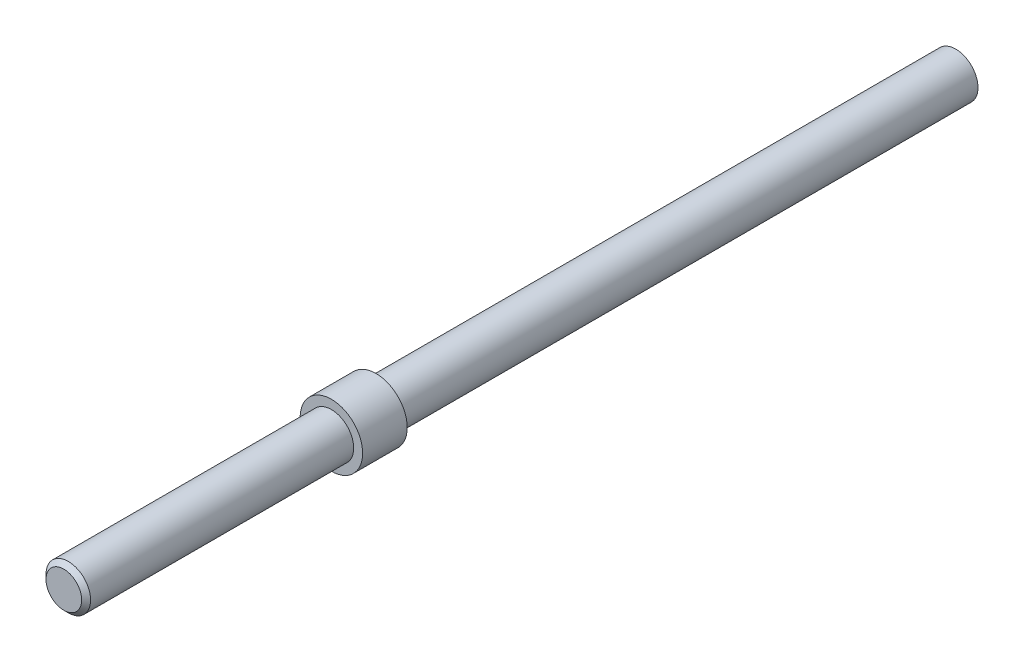
ISO-10303-21;
HEADER;
FILE_DESCRIPTION(('STEP AP214'),'2;1');
FILE_NAME('part.step','',(''),(''),'','','');
FILE_SCHEMA(('AUTOMOTIVE_DESIGN { 1 0 10303 214 1 1 1 1 }'));
ENDSEC;
DATA;
#1=APPLICATION_CONTEXT('core data for automotive mechanical design processes');
#2=APPLICATION_PROTOCOL_DEFINITION('international standard','automotive_design',2000,#1);
#3=PRODUCT_CONTEXT('',#1,'mechanical');
#4=PRODUCT('Part','Part','',(#3));
#5=PRODUCT_RELATED_PRODUCT_CATEGORY('part','',(#4));
#6=PRODUCT_DEFINITION_FORMATION('','',#4);
#7=PRODUCT_DEFINITION_CONTEXT('part definition',#1,'design');
#8=PRODUCT_DEFINITION('design','',#6,#7);
#9=PRODUCT_DEFINITION_SHAPE('','',#8);
#10=(LENGTH_UNIT() NAMED_UNIT(*) SI_UNIT(.MILLI.,.METRE.));
#11=(NAMED_UNIT(*) PLANE_ANGLE_UNIT() SI_UNIT($,.RADIAN.));
#12=(NAMED_UNIT(*) SI_UNIT($,.STERADIAN.) SOLID_ANGLE_UNIT());
#13=UNCERTAINTY_MEASURE_WITH_UNIT(LENGTH_MEASURE(1.E-05),#10,'distance_accuracy_value','');
#14=(GEOMETRIC_REPRESENTATION_CONTEXT(3) GLOBAL_UNCERTAINTY_ASSIGNED_CONTEXT((#13)) GLOBAL_UNIT_ASSIGNED_CONTEXT((#10,
#11,#12)) REPRESENTATION_CONTEXT('',''));
#15=CARTESIAN_POINT('',(0.,0.,0.));
#16=DIRECTION('',(0.,0.,1.));
#17=DIRECTION('',(1.,0.,0.));
#18=AXIS2_PLACEMENT_3D('',#15,#16,#17);
#19=CARTESIAN_POINT('',(0.,0.,200.));
#20=DIRECTION('',(0.,0.,-1.));
#21=DIRECTION('',(-1.,0.,0.));
#22=AXIS2_PLACEMENT_3D('',#19,#20,#21);
#23=CYLINDRICAL_SURFACE('',#22,5.);
#24=CARTESIAN_POINT('',(0.,0.,140.));
#25=DIRECTION('',(0.,0.,1.));
#26=DIRECTION('',(1.,0.,0.));
#27=AXIS2_PLACEMENT_3D('',#24,#25,#26);
#28=CIRCLE('',#27,5.);
#29=CARTESIAN_POINT('',(5.,0.,140.));
#30=VERTEX_POINT('',#29);
#31=EDGE_CURVE('E41',#30,#30,#28,.T.);
#32=ORIENTED_EDGE('',*,*,#31,.T.);
#33=EDGE_LOOP('',(#32));
#34=FACE_BOUND('',#33,.T.);
#35=CARTESIAN_POINT('',(0.,0.,199.));
#36=DIRECTION('',(0.,0.,1.));
#37=DIRECTION('',(1.,0.,0.));
#38=AXIS2_PLACEMENT_3D('',#35,#36,#37);
#39=CIRCLE('',#38,5.);
#40=CARTESIAN_POINT('',(5.,0.,199.));
#41=VERTEX_POINT('',#40);
#42=EDGE_CURVE('E46',#41,#41,#39,.F.);
#43=ORIENTED_EDGE('',*,*,#42,.T.);
#44=EDGE_LOOP('',(#43));
#45=FACE_BOUND('',#44,.T.);
#46=ADVANCED_FACE('F37',(#34,#45),#23,.T.);
#47=CARTESIAN_POINT('',(0.,0.,200.));
#48=DIRECTION('',(0.,0.,1.));
#49=DIRECTION('',(1.,0.,0.));
#50=AXIS2_PLACEMENT_3D('',#47,#48,#49);
#51=PLANE('',#50);
#52=CARTESIAN_POINT('',(0.,0.,200.));
#53=DIRECTION('',(0.,0.,1.));
#54=DIRECTION('',(1.,0.,0.));
#55=AXIS2_PLACEMENT_3D('',#52,#53,#54);
#56=CIRCLE('',#55,4.);
#57=CARTESIAN_POINT('',(4.,0.,200.));
#58=VERTEX_POINT('',#57);
#59=EDGE_CURVE('E51',#58,#58,#56,.T.);
#60=ORIENTED_EDGE('',*,*,#59,.T.);
#61=EDGE_LOOP('',(#60));
#62=FACE_BOUND('',#61,.T.);
#63=ADVANCED_FACE('F90',(#62),#51,.T.);
#64=CARTESIAN_POINT('',(0.,0.,200.));
#65=DIRECTION('',(0.,0.,-1.));
#66=DIRECTION('',(-1.,0.,0.));
#67=AXIS2_PLACEMENT_3D('',#64,#65,#66);
#68=CONICAL_SURFACE('',#67,4.,0.785398163397446);
#69=ORIENTED_EDGE('',*,*,#42,.F.);
#70=EDGE_LOOP('',(#69));
#71=FACE_BOUND('',#70,.T.);
#72=ORIENTED_EDGE('',*,*,#59,.F.);
#73=EDGE_LOOP('',(#72));
#74=FACE_BOUND('',#73,.T.);
#75=ADVANCED_FACE('F39',(#71,#74),#68,.T.);
#76=CARTESIAN_POINT('',(0.,0.,140.));
#77=DIRECTION('',(0.,0.,-1.));
#78=DIRECTION('',(-1.,0.,0.));
#79=AXIS2_PLACEMENT_3D('',#76,#77,#78);
#80=CYLINDRICAL_SURFACE('',#79,7.);
#81=CARTESIAN_POINT('',(0.,0.,140.));
#82=DIRECTION('',(0.,0.,1.));
#83=DIRECTION('',(1.,0.,0.));
#84=AXIS2_PLACEMENT_3D('',#81,#82,#83);
#85=CIRCLE('',#84,7.);
#86=CARTESIAN_POINT('',(7.,0.,140.));
#87=VERTEX_POINT('',#86);
#88=EDGE_CURVE('E65',#87,#87,#85,.T.);
#89=ORIENTED_EDGE('',*,*,#88,.F.);
#90=EDGE_LOOP('',(#89));
#91=FACE_BOUND('',#90,.T.);
#92=CARTESIAN_POINT('',(0.,0.,130.));
#93=DIRECTION('',(0.,0.,1.));
#94=DIRECTION('',(1.,0.,0.));
#95=AXIS2_PLACEMENT_3D('',#92,#93,#94);
#96=CIRCLE('',#95,7.);
#97=CARTESIAN_POINT('',(7.,0.,130.));
#98=VERTEX_POINT('',#97);
#99=EDGE_CURVE('E61',#98,#98,#96,.T.);
#100=ORIENTED_EDGE('',*,*,#99,.T.);
#101=EDGE_LOOP('',(#100));
#102=FACE_BOUND('',#101,.T.);
#103=ADVANCED_FACE('F79',(#91,#102),#80,.T.);
#104=CARTESIAN_POINT('',(0.,0.,140.));
#105=DIRECTION('',(0.,0.,1.));
#106=DIRECTION('',(1.,0.,0.));
#107=AXIS2_PLACEMENT_3D('',#104,#105,#106);
#108=PLANE('',#107);
#109=ORIENTED_EDGE('',*,*,#31,.F.);
#110=EDGE_LOOP('',(#109));
#111=FACE_BOUND('',#110,.T.);
#112=ORIENTED_EDGE('',*,*,#88,.T.);
#113=EDGE_LOOP('',(#112));
#114=FACE_BOUND('',#113,.T.);
#115=ADVANCED_FACE('F76',(#111,#114),#108,.T.);
#116=CARTESIAN_POINT('',(0.,0.,130.));
#117=DIRECTION('',(0.,0.,1.));
#118=DIRECTION('',(1.,0.,0.));
#119=AXIS2_PLACEMENT_3D('',#116,#117,#118);
#120=PLANE('',#119);
#121=CARTESIAN_POINT('',(0.,0.,130.));
#122=DIRECTION('',(0.,0.,1.));
#123=DIRECTION('',(1.,0.,0.));
#124=AXIS2_PLACEMENT_3D('',#121,#122,#123);
#125=CIRCLE('',#124,5.);
#126=CARTESIAN_POINT('',(5.,0.,130.));
#127=VERTEX_POINT('',#126);
#128=EDGE_CURVE('E10',#127,#127,#125,.T.);
#129=ORIENTED_EDGE('',*,*,#128,.T.);
#130=EDGE_LOOP('',(#129));
#131=FACE_BOUND('',#130,.T.);
#132=ORIENTED_EDGE('',*,*,#99,.F.);
#133=EDGE_LOOP('',(#132));
#134=FACE_BOUND('',#133,.T.);
#135=ADVANCED_FACE('F78',(#131,#134),#120,.F.);
#136=CARTESIAN_POINT('',(0.,0.,0.));
#137=DIRECTION('',(0.,0.,1.));
#138=DIRECTION('',(1.,0.,0.));
#139=AXIS2_PLACEMENT_3D('',#136,#137,#138);
#140=PLANE('',#139);
#141=CARTESIAN_POINT('',(0.,0.,0.));
#142=DIRECTION('',(0.,0.,1.));
#143=DIRECTION('',(1.,0.,0.));
#144=AXIS2_PLACEMENT_3D('',#141,#142,#143);
#145=CIRCLE('',#144,5.);
#146=CARTESIAN_POINT('',(5.,0.,0.));
#147=VERTEX_POINT('',#146);
#148=EDGE_CURVE('E57',#147,#147,#145,.T.);
#149=ORIENTED_EDGE('',*,*,#148,.F.);
#150=EDGE_LOOP('',(#149));
#151=FACE_BOUND('',#150,.T.);
#152=ADVANCED_FACE('F85',(#151),#140,.F.);
#153=ORIENTED_EDGE('',*,*,#148,.T.);
#154=EDGE_LOOP('',(#153));
#155=FACE_BOUND('',#154,.T.);
#156=ORIENTED_EDGE('',*,*,#128,.F.);
#157=EDGE_LOOP('',(#156));
#158=FACE_BOUND('',#157,.T.);
#159=ADVANCED_FACE('F91',(#155,#158),#23,.T.);
#160=CLOSED_SHELL('',(#46,#63,#75,#103,#115,#135,#152,#159));
#161=MANIFOLD_SOLID_BREP('B2',#160);
#162=ADVANCED_BREP_SHAPE_REPRESENTATION('',(#18,#161),#14);
#163=SHAPE_DEFINITION_REPRESENTATION(#9,#162);
ENDSEC;
END-ISO-10303-21;
